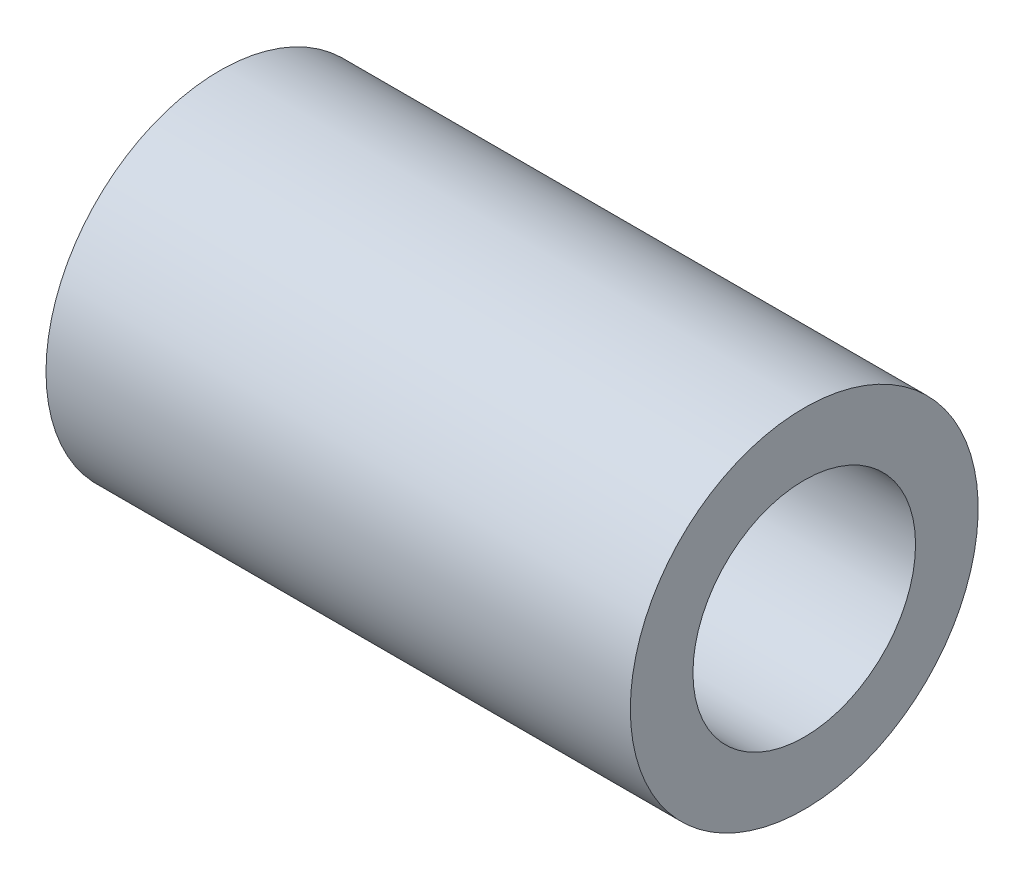
ISO-10303-21;
HEADER;
FILE_DESCRIPTION(('STEP AP214'),'2;1');
FILE_NAME('part.step','',(''),(''),'','','');
FILE_SCHEMA(('AUTOMOTIVE_DESIGN { 1 0 10303 214 1 1 1 1 }'));
ENDSEC;
DATA;
#1=APPLICATION_CONTEXT('core data for automotive mechanical design processes');
#2=APPLICATION_PROTOCOL_DEFINITION('international standard','automotive_design',2000,#1);
#3=PRODUCT_CONTEXT('',#1,'mechanical');
#4=PRODUCT('Part','Part','',(#3));
#5=PRODUCT_RELATED_PRODUCT_CATEGORY('part','',(#4));
#6=PRODUCT_DEFINITION_FORMATION('','',#4);
#7=PRODUCT_DEFINITION_CONTEXT('part definition',#1,'design');
#8=PRODUCT_DEFINITION('design','',#6,#7);
#9=PRODUCT_DEFINITION_SHAPE('','',#8);
#10=(LENGTH_UNIT() NAMED_UNIT(*) SI_UNIT(.MILLI.,.METRE.));
#11=(NAMED_UNIT(*) PLANE_ANGLE_UNIT() SI_UNIT($,.RADIAN.));
#12=(NAMED_UNIT(*) SI_UNIT($,.STERADIAN.) SOLID_ANGLE_UNIT());
#13=UNCERTAINTY_MEASURE_WITH_UNIT(LENGTH_MEASURE(1.E-05),#10,'distance_accuracy_value','');
#14=(GEOMETRIC_REPRESENTATION_CONTEXT(3) GLOBAL_UNCERTAINTY_ASSIGNED_CONTEXT((#13)) GLOBAL_UNIT_ASSIGNED_CONTEXT((#10,
#11,#12)) REPRESENTATION_CONTEXT('',''));
#15=CARTESIAN_POINT('',(0.,0.,0.));
#16=DIRECTION('',(0.,0.,1.));
#17=DIRECTION('',(1.,0.,0.));
#18=AXIS2_PLACEMENT_3D('',#15,#16,#17);
#19=CARTESIAN_POINT('',(8.4,0.,0.));
#20=DIRECTION('',(1.,0.,0.));
#21=DIRECTION('',(0.,0.,1.));
#22=AXIS2_PLACEMENT_3D('',#19,#20,#21);
#23=PLANE('',#22);
#24=CARTESIAN_POINT('',(8.4,0.,0.));
#25=DIRECTION('',(-1.,0.,0.));
#26=DIRECTION('',(0.,0.,1.));
#27=AXIS2_PLACEMENT_3D('',#24,#25,#26);
#28=CIRCLE('',#27,2.5);
#29=CARTESIAN_POINT('',(8.4,0.,2.5));
#30=VERTEX_POINT('',#29);
#31=EDGE_CURVE('E10',#30,#30,#28,.T.);
#32=ORIENTED_EDGE('',*,*,#31,.F.);
#33=EDGE_LOOP('',(#32));
#34=FACE_BOUND('',#33,.T.);
#35=CARTESIAN_POINT('',(8.4,0.,0.));
#36=DIRECTION('',(-1.,0.,0.));
#37=DIRECTION('',(0.,0.,1.));
#38=AXIS2_PLACEMENT_3D('',#35,#36,#37);
#39=CIRCLE('',#38,1.6);
#40=CARTESIAN_POINT('',(8.4,0.,1.6));
#41=VERTEX_POINT('',#40);
#42=EDGE_CURVE('E46',#41,#41,#39,.T.);
#43=ORIENTED_EDGE('',*,*,#42,.T.);
#44=EDGE_LOOP('',(#43));
#45=FACE_BOUND('',#44,.T.);
#46=ADVANCED_FACE('F35',(#34,#45),#23,.T.);
#47=CARTESIAN_POINT('',(0.,0.,0.));
#48=DIRECTION('',(1.,0.,0.));
#49=DIRECTION('',(0.,0.,1.));
#50=AXIS2_PLACEMENT_3D('',#47,#48,#49);
#51=PLANE('',#50);
#52=CARTESIAN_POINT('',(0.,0.,0.));
#53=DIRECTION('',(-1.,0.,0.));
#54=DIRECTION('',(0.,0.,1.));
#55=AXIS2_PLACEMENT_3D('',#52,#53,#54);
#56=CIRCLE('',#55,2.5);
#57=CARTESIAN_POINT('',(0.,0.,2.5));
#58=VERTEX_POINT('',#57);
#59=EDGE_CURVE('E39',#58,#58,#56,.T.);
#60=ORIENTED_EDGE('',*,*,#59,.T.);
#61=EDGE_LOOP('',(#60));
#62=FACE_BOUND('',#61,.T.);
#63=CARTESIAN_POINT('',(0.,0.,0.));
#64=DIRECTION('',(-1.,0.,0.));
#65=DIRECTION('',(0.,0.,1.));
#66=AXIS2_PLACEMENT_3D('',#63,#64,#65);
#67=CIRCLE('',#66,1.6);
#68=CARTESIAN_POINT('',(0.,0.,1.6));
#69=VERTEX_POINT('',#68);
#70=EDGE_CURVE('E48',#69,#69,#67,.T.);
#71=ORIENTED_EDGE('',*,*,#70,.F.);
#72=EDGE_LOOP('',(#71));
#73=FACE_BOUND('',#72,.T.);
#74=ADVANCED_FACE('F61',(#62,#73),#51,.F.);
#75=CARTESIAN_POINT('',(8.4,0.,0.));
#76=DIRECTION('',(-1.,0.,0.));
#77=DIRECTION('',(0.,0.,-1.));
#78=AXIS2_PLACEMENT_3D('',#75,#76,#77);
#79=CYLINDRICAL_SURFACE('',#78,2.5);
#80=ORIENTED_EDGE('',*,*,#31,.T.);
#81=EDGE_LOOP('',(#80));
#82=FACE_BOUND('',#81,.T.);
#83=ORIENTED_EDGE('',*,*,#59,.F.);
#84=EDGE_LOOP('',(#83));
#85=FACE_BOUND('',#84,.T.);
#86=ADVANCED_FACE('F37',(#82,#85),#79,.T.);
#87=CARTESIAN_POINT('',(8.4,0.,0.));
#88=DIRECTION('',(-1.,0.,0.));
#89=DIRECTION('',(0.,0.,-1.));
#90=AXIS2_PLACEMENT_3D('',#87,#88,#89);
#91=CYLINDRICAL_SURFACE('',#90,1.6);
#92=ORIENTED_EDGE('',*,*,#42,.F.);
#93=EDGE_LOOP('',(#92));
#94=FACE_BOUND('',#93,.T.);
#95=ORIENTED_EDGE('',*,*,#70,.T.);
#96=EDGE_LOOP('',(#95));
#97=FACE_BOUND('',#96,.T.);
#98=ADVANCED_FACE('F55',(#94,#97),#91,.F.);
#99=CLOSED_SHELL('',(#46,#74,#86,#98));
#100=MANIFOLD_SOLID_BREP('B2',#99);
#101=ADVANCED_BREP_SHAPE_REPRESENTATION('',(#18,#100),#14);
#102=SHAPE_DEFINITION_REPRESENTATION(#9,#101);
ENDSEC;
END-ISO-10303-21;
